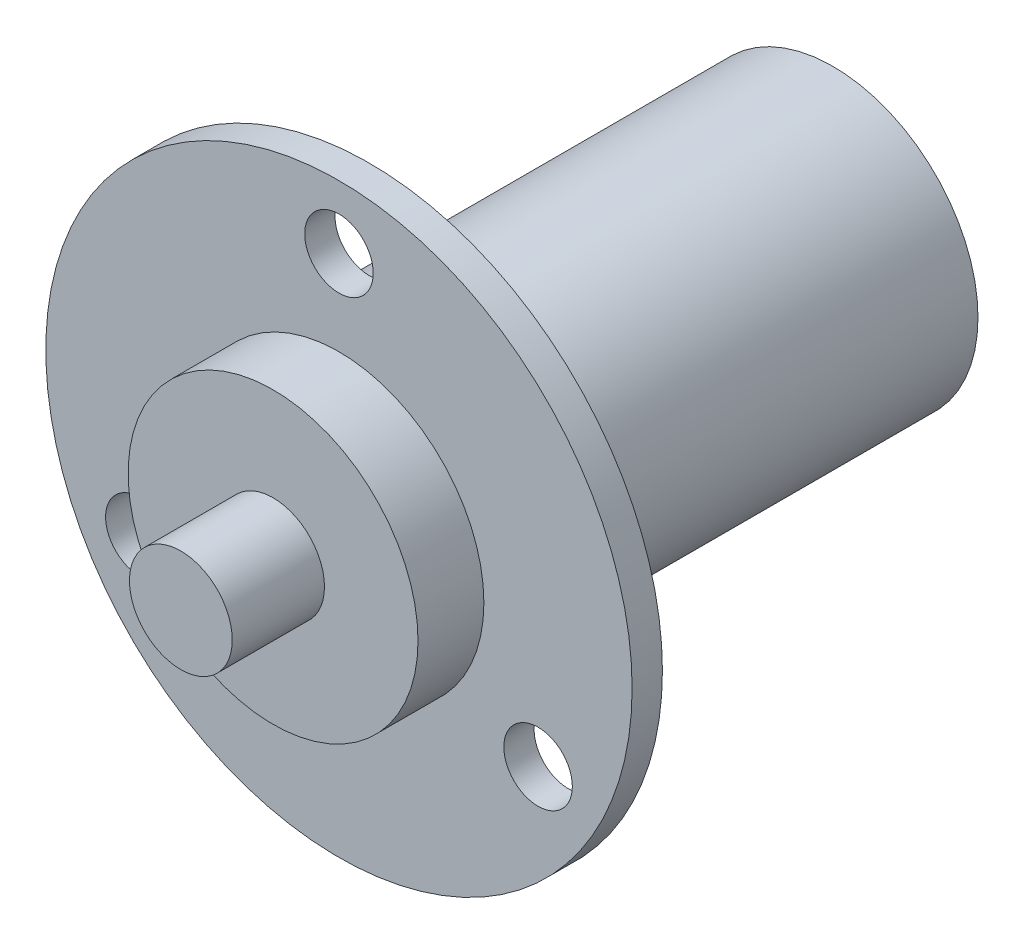
ISO-10303-21;
HEADER;
FILE_DESCRIPTION(('STEP AP214'),'2;1');
FILE_NAME('part.step','',(''),(''),'','','');
FILE_SCHEMA(('AUTOMOTIVE_DESIGN { 1 0 10303 214 1 1 1 1 }'));
ENDSEC;
DATA;
#1=APPLICATION_CONTEXT('core data for automotive mechanical design processes');
#2=APPLICATION_PROTOCOL_DEFINITION('international standard','automotive_design',2000,#1);
#3=PRODUCT_CONTEXT('',#1,'mechanical');
#4=PRODUCT('Part','Part','',(#3));
#5=PRODUCT_RELATED_PRODUCT_CATEGORY('part','',(#4));
#6=PRODUCT_DEFINITION_FORMATION('','',#4);
#7=PRODUCT_DEFINITION_CONTEXT('part definition',#1,'design');
#8=PRODUCT_DEFINITION('design','',#6,#7);
#9=PRODUCT_DEFINITION_SHAPE('','',#8);
#10=(LENGTH_UNIT() NAMED_UNIT(*) SI_UNIT(.MILLI.,.METRE.));
#11=(NAMED_UNIT(*) PLANE_ANGLE_UNIT() SI_UNIT($,.RADIAN.));
#12=(NAMED_UNIT(*) SI_UNIT($,.STERADIAN.) SOLID_ANGLE_UNIT());
#13=UNCERTAINTY_MEASURE_WITH_UNIT(LENGTH_MEASURE(1.E-05),#10,'distance_accuracy_value','');
#14=(GEOMETRIC_REPRESENTATION_CONTEXT(3) GLOBAL_UNCERTAINTY_ASSIGNED_CONTEXT((#13)) GLOBAL_UNIT_ASSIGNED_CONTEXT((#10,
#11,#12)) REPRESENTATION_CONTEXT('',''));
#15=CARTESIAN_POINT('',(0.,0.,0.));
#16=DIRECTION('',(0.,0.,1.));
#17=DIRECTION('',(1.,0.,0.));
#18=AXIS2_PLACEMENT_3D('',#15,#16,#17);
#19=CARTESIAN_POINT('',(0.,0.,-37.5));
#20=DIRECTION('',(0.,0.,1.));
#21=DIRECTION('',(1.,0.,0.));
#22=AXIS2_PLACEMENT_3D('',#19,#20,#21);
#23=CYLINDRICAL_SURFACE('',#22,11.);
#24=CARTESIAN_POINT('',(0.,0.,-37.5));
#25=DIRECTION('',(0.,0.,1.));
#26=DIRECTION('',(1.,0.,0.));
#27=AXIS2_PLACEMENT_3D('',#24,#25,#26);
#28=CIRCLE('',#27,11.);
#29=CARTESIAN_POINT('',(11.,0.,-37.5));
#30=VERTEX_POINT('',#29);
#31=EDGE_CURVE('E43',#30,#30,#28,.T.);
#32=ORIENTED_EDGE('',*,*,#31,.T.);
#33=EDGE_LOOP('',(#32));
#34=FACE_BOUND('',#33,.T.);
#35=CARTESIAN_POINT('',(0.,0.,-2.3));
#36=DIRECTION('',(0.,0.,1.));
#37=DIRECTION('',(1.,0.,0.));
#38=AXIS2_PLACEMENT_3D('',#35,#36,#37);
#39=CIRCLE('',#38,11.);
#40=CARTESIAN_POINT('',(11.,0.,-2.3));
#41=VERTEX_POINT('',#40);
#42=EDGE_CURVE('E73',#41,#41,#39,.T.);
#43=ORIENTED_EDGE('',*,*,#42,.F.);
#44=EDGE_LOOP('',(#43));
#45=FACE_BOUND('',#44,.T.);
#46=ADVANCED_FACE('F36',(#34,#45),#23,.T.);
#47=CARTESIAN_POINT('',(0.,0.,0.));
#48=DIRECTION('',(0.,0.,1.));
#49=DIRECTION('',(1.,0.,0.));
#50=AXIS2_PLACEMENT_3D('',#47,#48,#49);
#51=CIRCLE('',#50,11.);
#52=CARTESIAN_POINT('',(11.,0.,0.));
#53=VERTEX_POINT('',#52);
#54=EDGE_CURVE('E10',#53,#53,#51,.F.);
#55=ORIENTED_EDGE('',*,*,#54,.F.);
#56=EDGE_LOOP('',(#55));
#57=FACE_BOUND('',#56,.T.);
#58=CARTESIAN_POINT('',(0.,0.,5.));
#59=DIRECTION('',(0.,0.,1.));
#60=DIRECTION('',(1.,0.,0.));
#61=AXIS2_PLACEMENT_3D('',#58,#59,#60);
#62=CIRCLE('',#61,11.);
#63=CARTESIAN_POINT('',(11.,0.,5.));
#64=VERTEX_POINT('',#63);
#65=EDGE_CURVE('E47',#64,#64,#62,.T.);
#66=ORIENTED_EDGE('',*,*,#65,.F.);
#67=EDGE_LOOP('',(#66));
#68=FACE_BOUND('',#67,.T.);
#69=ADVANCED_FACE('F38',(#57,#68),#23,.T.);
#70=CARTESIAN_POINT('',(0.,0.,-37.5));
#71=DIRECTION('',(0.,0.,1.));
#72=DIRECTION('',(1.,0.,0.));
#73=AXIS2_PLACEMENT_3D('',#70,#71,#72);
#74=PLANE('',#73);
#75=ORIENTED_EDGE('',*,*,#31,.F.);
#76=EDGE_LOOP('',(#75));
#77=FACE_BOUND('',#76,.T.);
#78=ADVANCED_FACE('F103',(#77),#74,.F.);
#79=CARTESIAN_POINT('',(0.,0.,5.));
#80=DIRECTION('',(0.,0.,1.));
#81=DIRECTION('',(1.,0.,0.));
#82=AXIS2_PLACEMENT_3D('',#79,#80,#81);
#83=PLANE('',#82);
#84=CARTESIAN_POINT('',(0.,0.,5.));
#85=DIRECTION('',(0.,0.,1.));
#86=DIRECTION('',(1.,0.,0.));
#87=AXIS2_PLACEMENT_3D('',#84,#85,#86);
#88=CIRCLE('',#87,3.9);
#89=CARTESIAN_POINT('',(3.9,0.,5.));
#90=VERTEX_POINT('',#89);
#91=EDGE_CURVE('E51',#90,#90,#88,.T.);
#92=ORIENTED_EDGE('',*,*,#91,.F.);
#93=EDGE_LOOP('',(#92));
#94=FACE_BOUND('',#93,.T.);
#95=ORIENTED_EDGE('',*,*,#65,.T.);
#96=EDGE_LOOP('',(#95));
#97=FACE_BOUND('',#96,.T.);
#98=ADVANCED_FACE('F133',(#94,#97),#83,.T.);
#99=CARTESIAN_POINT('',(0.,17.45,-2.3));
#100=DIRECTION('',(0.,0.,1.));
#101=DIRECTION('',(1.,0.,0.));
#102=AXIS2_PLACEMENT_3D('',#99,#100,#101);
#103=CYLINDRICAL_SURFACE('',#102,2.6);
#104=CARTESIAN_POINT('',(0.,17.45,-2.3));
#105=DIRECTION('',(0.,0.,1.));
#106=DIRECTION('',(1.,0.,0.));
#107=AXIS2_PLACEMENT_3D('',#104,#105,#106);
#108=CIRCLE('',#107,2.6);
#109=CARTESIAN_POINT('',(2.6,17.45,-2.3));
#110=VERTEX_POINT('',#109);
#111=EDGE_CURVE('E76',#110,#110,#108,.T.);
#112=ORIENTED_EDGE('',*,*,#111,.F.);
#113=EDGE_LOOP('',(#112));
#114=FACE_BOUND('',#113,.T.);
#115=CARTESIAN_POINT('',(0.,17.45,0.));
#116=DIRECTION('',(0.,0.,1.));
#117=DIRECTION('',(1.,0.,0.));
#118=AXIS2_PLACEMENT_3D('',#115,#116,#117);
#119=CIRCLE('',#118,2.6);
#120=CARTESIAN_POINT('',(2.6,17.45,0.));
#121=VERTEX_POINT('',#120);
#122=EDGE_CURVE('E61',#121,#121,#119,.T.);
#123=ORIENTED_EDGE('',*,*,#122,.T.);
#124=EDGE_LOOP('',(#123));
#125=FACE_BOUND('',#124,.T.);
#126=ADVANCED_FACE('F129',(#114,#125),#103,.F.);
#127=CARTESIAN_POINT('',(15.1121432960385,-8.725,-2.3));
#128=DIRECTION('',(0.,0.,1.));
#129=DIRECTION('',(1.,0.,0.));
#130=AXIS2_PLACEMENT_3D('',#127,#128,#129);
#131=CYLINDRICAL_SURFACE('',#130,2.60000000000008);
#132=CARTESIAN_POINT('',(15.1121432960385,-8.725,-2.3));
#133=DIRECTION('',(0.,0.,1.));
#134=DIRECTION('',(1.,0.,0.));
#135=AXIS2_PLACEMENT_3D('',#132,#133,#134);
#136=CIRCLE('',#135,2.60000000000008);
#137=CARTESIAN_POINT('',(17.7121432960385,-8.725,-2.3));
#138=VERTEX_POINT('',#137);
#139=EDGE_CURVE('E79',#138,#138,#136,.T.);
#140=ORIENTED_EDGE('',*,*,#139,.F.);
#141=EDGE_LOOP('',(#140));
#142=FACE_BOUND('',#141,.T.);
#143=CARTESIAN_POINT('',(15.1121432960385,-8.725,0.));
#144=DIRECTION('',(0.,0.,1.));
#145=DIRECTION('',(1.,0.,0.));
#146=AXIS2_PLACEMENT_3D('',#143,#144,#145);
#147=CIRCLE('',#146,2.60000000000008);
#148=CARTESIAN_POINT('',(17.7121432960385,-8.725,0.));
#149=VERTEX_POINT('',#148);
#150=EDGE_CURVE('E64',#149,#149,#147,.T.);
#151=ORIENTED_EDGE('',*,*,#150,.T.);
#152=EDGE_LOOP('',(#151));
#153=FACE_BOUND('',#152,.T.);
#154=ADVANCED_FACE('F132',(#142,#153),#131,.F.);
#155=CARTESIAN_POINT('',(-15.1121432960385,-8.725,-2.3));
#156=DIRECTION('',(0.,0.,1.));
#157=DIRECTION('',(1.,0.,0.));
#158=AXIS2_PLACEMENT_3D('',#155,#156,#157);
#159=CYLINDRICAL_SURFACE('',#158,2.60000000000016);
#160=CARTESIAN_POINT('',(-15.1121432960385,-8.725,-2.3));
#161=DIRECTION('',(0.,0.,1.));
#162=DIRECTION('',(1.,0.,0.));
#163=AXIS2_PLACEMENT_3D('',#160,#161,#162);
#164=CIRCLE('',#163,2.60000000000016);
#165=CARTESIAN_POINT('',(-12.5121432960383,-8.725,-2.3));
#166=VERTEX_POINT('',#165);
#167=EDGE_CURVE('E60',#166,#166,#164,.T.);
#168=ORIENTED_EDGE('',*,*,#167,.F.);
#169=EDGE_LOOP('',(#168));
#170=FACE_BOUND('',#169,.T.);
#171=CARTESIAN_POINT('',(-15.1121432960385,-8.725,0.));
#172=DIRECTION('',(0.,0.,1.));
#173=DIRECTION('',(1.,0.,0.));
#174=AXIS2_PLACEMENT_3D('',#171,#172,#173);
#175=CIRCLE('',#174,2.60000000000016);
#176=CARTESIAN_POINT('',(-12.5121432960383,-8.725,0.));
#177=VERTEX_POINT('',#176);
#178=EDGE_CURVE('E67',#177,#177,#175,.T.);
#179=ORIENTED_EDGE('',*,*,#178,.T.);
#180=EDGE_LOOP('',(#179));
#181=FACE_BOUND('',#180,.T.);
#182=ADVANCED_FACE('F117',(#170,#181),#159,.F.);
#183=CARTESIAN_POINT('',(0.,0.,-2.3));
#184=DIRECTION('',(0.,0.,1.));
#185=DIRECTION('',(1.,0.,0.));
#186=AXIS2_PLACEMENT_3D('',#183,#184,#185);
#187=CYLINDRICAL_SURFACE('',#186,22.25);
#188=CARTESIAN_POINT('',(0.,0.,-2.3));
#189=DIRECTION('',(0.,0.,1.));
#190=DIRECTION('',(1.,0.,0.));
#191=AXIS2_PLACEMENT_3D('',#188,#189,#190);
#192=CIRCLE('',#191,22.25);
#193=CARTESIAN_POINT('',(22.25,0.,-2.3));
#194=VERTEX_POINT('',#193);
#195=EDGE_CURVE('E56',#194,#194,#192,.T.);
#196=ORIENTED_EDGE('',*,*,#195,.T.);
#197=EDGE_LOOP('',(#196));
#198=FACE_BOUND('',#197,.T.);
#199=CARTESIAN_POINT('',(0.,0.,0.));
#200=DIRECTION('',(0.,0.,1.));
#201=DIRECTION('',(1.,0.,0.));
#202=AXIS2_PLACEMENT_3D('',#199,#200,#201);
#203=CIRCLE('',#202,22.25);
#204=CARTESIAN_POINT('',(22.25,0.,0.));
#205=VERTEX_POINT('',#204);
#206=EDGE_CURVE('E57',#205,#205,#203,.T.);
#207=ORIENTED_EDGE('',*,*,#206,.F.);
#208=EDGE_LOOP('',(#207));
#209=FACE_BOUND('',#208,.T.);
#210=ADVANCED_FACE('F111',(#198,#209),#187,.T.);
#211=CARTESIAN_POINT('',(0.,0.,-2.3));
#212=DIRECTION('',(0.,0.,1.));
#213=DIRECTION('',(1.,0.,0.));
#214=AXIS2_PLACEMENT_3D('',#211,#212,#213);
#215=PLANE('',#214);
#216=ORIENTED_EDGE('',*,*,#167,.T.);
#217=EDGE_LOOP('',(#216));
#218=FACE_BOUND('',#217,.T.);
#219=ORIENTED_EDGE('',*,*,#139,.T.);
#220=EDGE_LOOP('',(#219));
#221=FACE_BOUND('',#220,.T.);
#222=ORIENTED_EDGE('',*,*,#111,.T.);
#223=EDGE_LOOP('',(#222));
#224=FACE_BOUND('',#223,.T.);
#225=ORIENTED_EDGE('',*,*,#42,.T.);
#226=EDGE_LOOP('',(#225));
#227=FACE_BOUND('',#226,.T.);
#228=ORIENTED_EDGE('',*,*,#195,.F.);
#229=EDGE_LOOP('',(#228));
#230=FACE_BOUND('',#229,.T.);
#231=ADVANCED_FACE('F108',(#218,#221,#224,#227,#230),#215,.F.);
#232=CARTESIAN_POINT('',(0.,0.,0.));
#233=DIRECTION('',(0.,0.,1.));
#234=DIRECTION('',(1.,0.,0.));
#235=AXIS2_PLACEMENT_3D('',#232,#233,#234);
#236=PLANE('',#235);
#237=ORIENTED_EDGE('',*,*,#178,.F.);
#238=EDGE_LOOP('',(#237));
#239=FACE_BOUND('',#238,.T.);
#240=ORIENTED_EDGE('',*,*,#150,.F.);
#241=EDGE_LOOP('',(#240));
#242=FACE_BOUND('',#241,.T.);
#243=ORIENTED_EDGE('',*,*,#122,.F.);
#244=EDGE_LOOP('',(#243));
#245=FACE_BOUND('',#244,.T.);
#246=ORIENTED_EDGE('',*,*,#54,.T.);
#247=EDGE_LOOP('',(#246));
#248=FACE_BOUND('',#247,.T.);
#249=ORIENTED_EDGE('',*,*,#206,.T.);
#250=EDGE_LOOP('',(#249));
#251=FACE_BOUND('',#250,.T.);
#252=ADVANCED_FACE('F96',(#239,#242,#245,#248,#251),#236,.T.);
#253=CARTESIAN_POINT('',(0.,0.,12.));
#254=DIRECTION('',(0.,0.,1.));
#255=DIRECTION('',(1.,0.,0.));
#256=AXIS2_PLACEMENT_3D('',#253,#254,#255);
#257=PLANE('',#256);
#258=CARTESIAN_POINT('',(0.,0.,12.));
#259=DIRECTION('',(0.,0.,1.));
#260=DIRECTION('',(1.,0.,0.));
#261=AXIS2_PLACEMENT_3D('',#258,#259,#260);
#262=CIRCLE('',#261,3.9);
#263=CARTESIAN_POINT('',(3.9,0.,12.));
#264=VERTEX_POINT('',#263);
#265=EDGE_CURVE('E70',#264,#264,#262,.T.);
#266=ORIENTED_EDGE('',*,*,#265,.T.);
#267=EDGE_LOOP('',(#266));
#268=FACE_BOUND('',#267,.T.);
#269=ADVANCED_FACE('F87',(#268),#257,.T.);
#270=CARTESIAN_POINT('',(0.,0.,-48.5308657865101));
#271=DIRECTION('',(0.,0.,1.));
#272=DIRECTION('',(1.,0.,0.));
#273=AXIS2_PLACEMENT_3D('',#270,#271,#272);
#274=CYLINDRICAL_SURFACE('',#273,3.9);
#275=ORIENTED_EDGE('',*,*,#91,.T.);
#276=EDGE_LOOP('',(#275));
#277=FACE_BOUND('',#276,.T.);
#278=ORIENTED_EDGE('',*,*,#265,.F.);
#279=EDGE_LOOP('',(#278));
#280=FACE_BOUND('',#279,.T.);
#281=ADVANCED_FACE('F89',(#277,#280),#274,.T.);
#282=CLOSED_SHELL('',(#46,#69,#78,#98,#126,#154,#182,#210,#231,#252,#269,#281));
#283=MANIFOLD_SOLID_BREP('B2',#282);
#284=ADVANCED_BREP_SHAPE_REPRESENTATION('',(#18,#283),#14);
#285=SHAPE_DEFINITION_REPRESENTATION(#9,#284);
ENDSEC;
END-ISO-10303-21;
